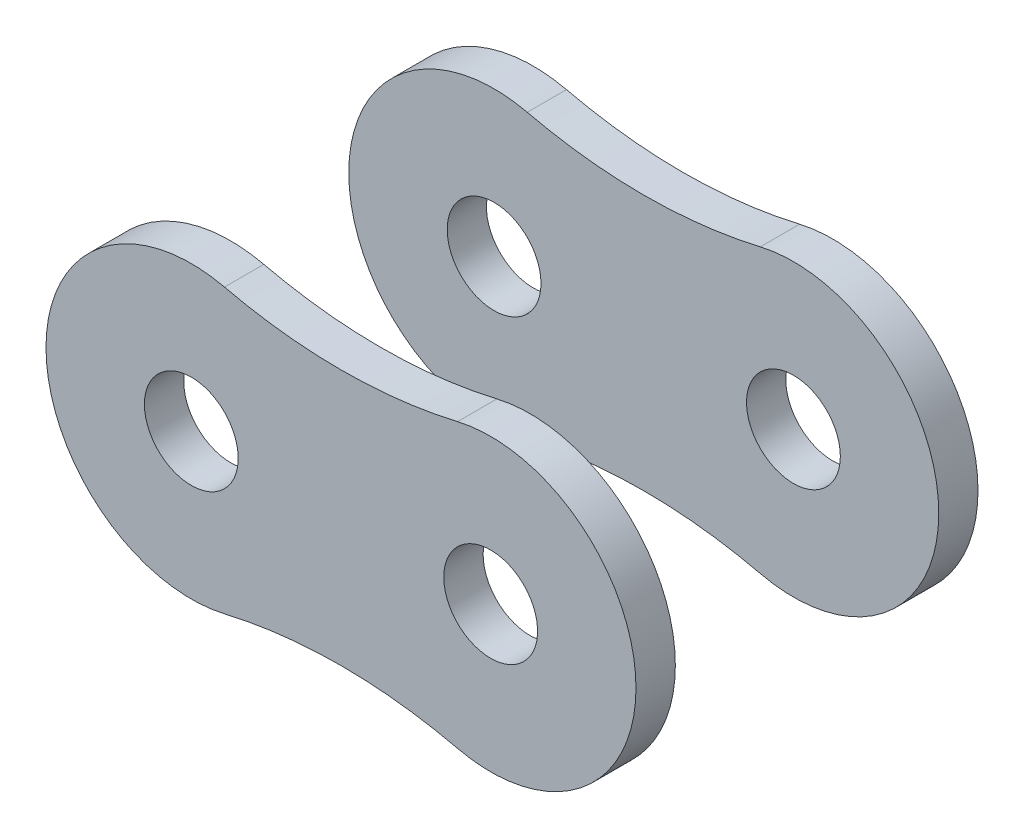
ISO-10303-21;
HEADER;
FILE_DESCRIPTION(('STEP AP214'),'2;1');
FILE_NAME('part.step','',(''),(''),'','','');
FILE_SCHEMA(('AUTOMOTIVE_DESIGN { 1 0 10303 214 1 1 1 1 }'));
ENDSEC;
DATA;
#1=APPLICATION_CONTEXT('core data for automotive mechanical design processes');
#2=APPLICATION_PROTOCOL_DEFINITION('international standard','automotive_design',2000,#1);
#3=PRODUCT_CONTEXT('',#1,'mechanical');
#4=PRODUCT('Part','Part','',(#3));
#5=PRODUCT_RELATED_PRODUCT_CATEGORY('part','',(#4));
#6=PRODUCT_DEFINITION_FORMATION('','',#4);
#7=PRODUCT_DEFINITION_CONTEXT('part definition',#1,'design');
#8=PRODUCT_DEFINITION('design','',#6,#7);
#9=PRODUCT_DEFINITION_SHAPE('','',#8);
#10=(LENGTH_UNIT() NAMED_UNIT(*) SI_UNIT(.MILLI.,.METRE.));
#11=(NAMED_UNIT(*) PLANE_ANGLE_UNIT() SI_UNIT($,.RADIAN.));
#12=(NAMED_UNIT(*) SI_UNIT($,.STERADIAN.) SOLID_ANGLE_UNIT());
#13=UNCERTAINTY_MEASURE_WITH_UNIT(LENGTH_MEASURE(1.E-05),#10,'distance_accuracy_value','');
#14=(GEOMETRIC_REPRESENTATION_CONTEXT(3) GLOBAL_UNCERTAINTY_ASSIGNED_CONTEXT((#13)) GLOBAL_UNIT_ASSIGNED_CONTEXT((#10,
#11,#12)) REPRESENTATION_CONTEXT('',''));
#15=CARTESIAN_POINT('',(0.,0.,0.));
#16=DIRECTION('',(0.,0.,1.));
#17=DIRECTION('',(1.,0.,0.));
#18=AXIS2_PLACEMENT_3D('',#15,#16,#17);
#19=CARTESIAN_POINT('',(3.175,-13.5598083674165,12.84));
#20=DIRECTION('',(0.,0.,-1.));
#21=DIRECTION('',(-1.,0.,0.));
#22=AXIS2_PLACEMENT_3D('',#19,#20,#21);
#23=PLANE('',#22);
#24=CARTESIAN_POINT('',(-6.35,0.,12.84));
#25=DIRECTION('',(0.,0.,-1.));
#26=DIRECTION('',(-1.,0.,0.));
#27=AXIS2_PLACEMENT_3D('',#24,#25,#26);
#28=CIRCLE('',#27,1.99);
#29=CARTESIAN_POINT('',(-8.34,0.,12.84));
#30=VERTEX_POINT('',#29);
#31=EDGE_CURVE('E126',#30,#30,#28,.T.);
#32=ORIENTED_EDGE('',*,*,#31,.F.);
#33=EDGE_LOOP('',(#32));
#34=FACE_BOUND('',#33,.T.);
#35=CARTESIAN_POINT('',(0.,-27.119616734833,12.84));
#36=DIRECTION('',(0.,0.,1.));
#37=DIRECTION('',(-1.,0.,0.));
#38=AXIS2_PLACEMENT_3D('',#35,#36,#37);
#39=CIRCLE('',#38,21.688116734833);
#40=CARTESIAN_POINT('',(4.94449301948166,-6.00264734327399,12.84));
#41=VERTEX_POINT('',#40);
#42=CARTESIAN_POINT('',(-4.94449301948166,-6.00264734327399,12.84));
#43=VERTEX_POINT('',#42);
#44=EDGE_CURVE('E106',#41,#43,#39,.T.);
#45=ORIENTED_EDGE('',*,*,#44,.T.);
#46=CARTESIAN_POINT('',(-6.35,0.,12.84));
#47=DIRECTION('',(0.,0.,-1.));
#48=DIRECTION('',(-1.,0.,0.));
#49=AXIS2_PLACEMENT_3D('',#46,#47,#48);
#50=CIRCLE('',#49,6.165);
#51=CARTESIAN_POINT('',(-4.94449301948167,6.00264734327399,12.84));
#52=VERTEX_POINT('',#51);
#53=EDGE_CURVE('E101',#43,#52,#50,.T.);
#54=ORIENTED_EDGE('',*,*,#53,.T.);
#55=CARTESIAN_POINT('',(0.,27.119616734833,12.84));
#56=DIRECTION('',(0.,0.,1.));
#57=DIRECTION('',(-1.,0.,0.));
#58=AXIS2_PLACEMENT_3D('',#55,#56,#57);
#59=CIRCLE('',#58,21.688116734833);
#60=CARTESIAN_POINT('',(4.94449301948166,6.00264734327399,12.84));
#61=VERTEX_POINT('',#60);
#62=EDGE_CURVE('E104',#52,#61,#59,.T.);
#63=ORIENTED_EDGE('',*,*,#62,.T.);
#64=CARTESIAN_POINT('',(6.35,0.,12.84));
#65=DIRECTION('',(0.,0.,-1.));
#66=DIRECTION('',(-1.,0.,0.));
#67=AXIS2_PLACEMENT_3D('',#64,#65,#66);
#68=CIRCLE('',#67,6.165);
#69=EDGE_CURVE('E71',#61,#41,#68,.T.);
#70=ORIENTED_EDGE('',*,*,#69,.T.);
#71=EDGE_LOOP('',(#45,#54,#63,#70));
#72=FACE_BOUND('',#71,.T.);
#73=CARTESIAN_POINT('',(6.35,0.,12.84));
#74=DIRECTION('',(0.,0.,-1.));
#75=DIRECTION('',(-1.,0.,0.));
#76=AXIS2_PLACEMENT_3D('',#73,#74,#75);
#77=CIRCLE('',#76,1.99);
#78=CARTESIAN_POINT('',(4.36,0.,12.84));
#79=VERTEX_POINT('',#78);
#80=EDGE_CURVE('E148',#79,#79,#77,.T.);
#81=ORIENTED_EDGE('',*,*,#80,.F.);
#82=EDGE_LOOP('',(#81));
#83=FACE_BOUND('',#82,.T.);
#84=ADVANCED_FACE('F53',(#34,#72,#83),#23,.T.);
#85=CARTESIAN_POINT('',(3.175,-13.5598083674165,14.51));
#86=DIRECTION('',(0.,0.,-1.));
#87=DIRECTION('',(-1.,0.,0.));
#88=AXIS2_PLACEMENT_3D('',#85,#86,#87);
#89=PLANE('',#88);
#90=CARTESIAN_POINT('',(0.,-27.119616734833,14.51));
#91=DIRECTION('',(0.,0.,1.));
#92=DIRECTION('',(-1.,0.,0.));
#93=AXIS2_PLACEMENT_3D('',#90,#91,#92);
#94=CIRCLE('',#93,21.688116734833);
#95=CARTESIAN_POINT('',(4.94449301948166,-6.00264734327399,14.51));
#96=VERTEX_POINT('',#95);
#97=CARTESIAN_POINT('',(-4.94449301948166,-6.00264734327399,14.51));
#98=VERTEX_POINT('',#97);
#99=EDGE_CURVE('E122',#96,#98,#94,.T.);
#100=ORIENTED_EDGE('',*,*,#99,.F.);
#101=CARTESIAN_POINT('',(6.35,0.,14.51));
#102=DIRECTION('',(0.,0.,-1.));
#103=DIRECTION('',(-1.,0.,0.));
#104=AXIS2_PLACEMENT_3D('',#101,#102,#103);
#105=CIRCLE('',#104,6.165);
#106=CARTESIAN_POINT('',(4.94449301948166,6.00264734327399,14.51));
#107=VERTEX_POINT('',#106);
#108=EDGE_CURVE('E94',#107,#96,#105,.T.);
#109=ORIENTED_EDGE('',*,*,#108,.F.);
#110=CARTESIAN_POINT('',(0.,27.119616734833,14.51));
#111=DIRECTION('',(0.,0.,1.));
#112=DIRECTION('',(-1.,0.,0.));
#113=AXIS2_PLACEMENT_3D('',#110,#111,#112);
#114=CIRCLE('',#113,21.688116734833);
#115=CARTESIAN_POINT('',(-4.94449301948167,6.00264734327399,14.51));
#116=VERTEX_POINT('',#115);
#117=EDGE_CURVE('E88',#116,#107,#114,.T.);
#118=ORIENTED_EDGE('',*,*,#117,.F.);
#119=CARTESIAN_POINT('',(-6.35,0.,14.51));
#120=DIRECTION('',(0.,0.,-1.));
#121=DIRECTION('',(-1.,0.,0.));
#122=AXIS2_PLACEMENT_3D('',#119,#120,#121);
#123=CIRCLE('',#122,6.165);
#124=EDGE_CURVE('E111',#98,#116,#123,.T.);
#125=ORIENTED_EDGE('',*,*,#124,.F.);
#126=EDGE_LOOP('',(#100,#109,#118,#125));
#127=FACE_BOUND('',#126,.T.);
#128=CARTESIAN_POINT('',(-6.35,0.,14.51));
#129=DIRECTION('',(0.,0.,-1.));
#130=DIRECTION('',(-1.,0.,0.));
#131=AXIS2_PLACEMENT_3D('',#128,#129,#130);
#132=CIRCLE('',#131,1.99);
#133=CARTESIAN_POINT('',(-8.34,0.,14.51));
#134=VERTEX_POINT('',#133);
#135=EDGE_CURVE('E144',#134,#134,#132,.T.);
#136=ORIENTED_EDGE('',*,*,#135,.T.);
#137=EDGE_LOOP('',(#136));
#138=FACE_BOUND('',#137,.T.);
#139=CARTESIAN_POINT('',(6.35,0.,14.51));
#140=DIRECTION('',(0.,0.,-1.));
#141=DIRECTION('',(-1.,0.,0.));
#142=AXIS2_PLACEMENT_3D('',#139,#140,#141);
#143=CIRCLE('',#142,1.99);
#144=CARTESIAN_POINT('',(4.36,0.,14.51));
#145=VERTEX_POINT('',#144);
#146=EDGE_CURVE('E152',#145,#145,#143,.T.);
#147=ORIENTED_EDGE('',*,*,#146,.T.);
#148=EDGE_LOOP('',(#147));
#149=FACE_BOUND('',#148,.T.);
#150=ADVANCED_FACE('F139',(#127,#138,#149),#89,.F.);
#151=CARTESIAN_POINT('',(0.,-27.119616734833,12.84));
#152=DIRECTION('',(0.,0.,1.));
#153=DIRECTION('',(1.,0.,0.));
#154=AXIS2_PLACEMENT_3D('',#151,#152,#153);
#155=CYLINDRICAL_SURFACE('',#154,21.688116734833);
#156=ORIENTED_EDGE('',*,*,#99,.T.);
#157=DIRECTION('',(0.,0.,1.));
#158=VECTOR('',#157,1.);
#159=CARTESIAN_POINT('',(-4.94449301948166,-6.00264734327399,12.84));
#160=LINE('',#159,#158);
#161=EDGE_CURVE('E12',#43,#98,#160,.T.);
#162=ORIENTED_EDGE('',*,*,#161,.F.);
#163=ORIENTED_EDGE('',*,*,#44,.F.);
#164=DIRECTION('',(0.,0.,1.));
#165=VECTOR('',#164,1.);
#166=CARTESIAN_POINT('',(4.94449301948166,-6.00264734327399,12.84));
#167=LINE('',#166,#165);
#168=EDGE_CURVE('E118',#41,#96,#167,.T.);
#169=ORIENTED_EDGE('',*,*,#168,.T.);
#170=EDGE_LOOP('',(#156,#162,#163,#169));
#171=FACE_BOUND('',#170,.T.);
#172=ADVANCED_FACE('F55',(#171),#155,.F.);
#173=CARTESIAN_POINT('',(-6.35,0.,12.84));
#174=DIRECTION('',(0.,0.,1.));
#175=DIRECTION('',(1.,0.,0.));
#176=AXIS2_PLACEMENT_3D('',#173,#174,#175);
#177=CYLINDRICAL_SURFACE('',#176,6.165);
#178=ORIENTED_EDGE('',*,*,#124,.T.);
#179=DIRECTION('',(0.,0.,1.));
#180=VECTOR('',#179,1.);
#181=CARTESIAN_POINT('',(-4.94449301948167,6.00264734327399,12.84));
#182=LINE('',#181,#180);
#183=EDGE_CURVE('E63',#52,#116,#182,.T.);
#184=ORIENTED_EDGE('',*,*,#183,.F.);
#185=ORIENTED_EDGE('',*,*,#53,.F.);
#186=ORIENTED_EDGE('',*,*,#161,.T.);
#187=EDGE_LOOP('',(#178,#184,#185,#186));
#188=FACE_BOUND('',#187,.T.);
#189=ADVANCED_FACE('F110',(#188),#177,.T.);
#190=CARTESIAN_POINT('',(0.,27.119616734833,12.84));
#191=DIRECTION('',(0.,0.,1.));
#192=DIRECTION('',(1.,0.,0.));
#193=AXIS2_PLACEMENT_3D('',#190,#191,#192);
#194=CYLINDRICAL_SURFACE('',#193,21.688116734833);
#195=ORIENTED_EDGE('',*,*,#117,.T.);
#196=DIRECTION('',(0.,0.,1.));
#197=VECTOR('',#196,1.);
#198=CARTESIAN_POINT('',(4.94449301948166,6.00264734327399,12.84));
#199=LINE('',#198,#197);
#200=EDGE_CURVE('E113',#61,#107,#199,.T.);
#201=ORIENTED_EDGE('',*,*,#200,.F.);
#202=ORIENTED_EDGE('',*,*,#62,.F.);
#203=ORIENTED_EDGE('',*,*,#183,.T.);
#204=EDGE_LOOP('',(#195,#201,#202,#203));
#205=FACE_BOUND('',#204,.T.);
#206=ADVANCED_FACE('F114',(#205),#194,.F.);
#207=CARTESIAN_POINT('',(6.35,0.,12.84));
#208=DIRECTION('',(0.,0.,1.));
#209=DIRECTION('',(1.,0.,0.));
#210=AXIS2_PLACEMENT_3D('',#207,#208,#209);
#211=CYLINDRICAL_SURFACE('',#210,6.165);
#212=ORIENTED_EDGE('',*,*,#108,.T.);
#213=ORIENTED_EDGE('',*,*,#168,.F.);
#214=ORIENTED_EDGE('',*,*,#69,.F.);
#215=ORIENTED_EDGE('',*,*,#200,.T.);
#216=EDGE_LOOP('',(#212,#213,#214,#215));
#217=FACE_BOUND('',#216,.T.);
#218=ADVANCED_FACE('F136',(#217),#211,.T.);
#219=CARTESIAN_POINT('',(-6.35,0.,12.84));
#220=DIRECTION('',(0.,0.,1.));
#221=DIRECTION('',(1.,0.,0.));
#222=AXIS2_PLACEMENT_3D('',#219,#220,#221);
#223=CYLINDRICAL_SURFACE('',#222,1.99);
#224=ORIENTED_EDGE('',*,*,#31,.T.);
#225=EDGE_LOOP('',(#224));
#226=FACE_BOUND('',#225,.T.);
#227=ORIENTED_EDGE('',*,*,#135,.F.);
#228=EDGE_LOOP('',(#227));
#229=FACE_BOUND('',#228,.T.);
#230=ADVANCED_FACE('F171',(#226,#229),#223,.F.);
#231=CARTESIAN_POINT('',(6.35,0.,12.84));
#232=DIRECTION('',(0.,0.,1.));
#233=DIRECTION('',(1.,0.,0.));
#234=AXIS2_PLACEMENT_3D('',#231,#232,#233);
#235=CYLINDRICAL_SURFACE('',#234,1.99);
#236=ORIENTED_EDGE('',*,*,#80,.T.);
#237=EDGE_LOOP('',(#236));
#238=FACE_BOUND('',#237,.T.);
#239=ORIENTED_EDGE('',*,*,#146,.F.);
#240=EDGE_LOOP('',(#239));
#241=FACE_BOUND('',#240,.T.);
#242=ADVANCED_FACE('F160',(#238,#241),#235,.F.);
#243=CLOSED_SHELL('',(#84,#150,#172,#189,#206,#218,#230,#242));
#244=MANIFOLD_SOLID_BREP('B2',#243);
#245=CARTESIAN_POINT('',(0.,-27.119616734833,1.665));
#246=DIRECTION('',(0.,0.,-1.));
#247=DIRECTION('',(-1.,0.,0.));
#248=AXIS2_PLACEMENT_3D('',#245,#246,#247);
#249=CYLINDRICAL_SURFACE('',#248,21.688116734833);
#250=CARTESIAN_POINT('',(0.,-27.119616734833,0.));
#251=DIRECTION('',(0.,0.,-1.));
#252=DIRECTION('',(1.,0.,0.));
#253=AXIS2_PLACEMENT_3D('',#250,#251,#252);
#254=CIRCLE('',#253,21.688116734833);
#255=CARTESIAN_POINT('',(-4.94449301948166,-6.00264734327399,0.));
#256=VERTEX_POINT('',#255);
#257=CARTESIAN_POINT('',(4.94449301948166,-6.00264734327399,0.));
#258=VERTEX_POINT('',#257);
#259=EDGE_CURVE('E313',#256,#258,#254,.T.);
#260=ORIENTED_EDGE('',*,*,#259,.T.);
#261=DIRECTION('',(0.,0.,-1.));
#262=VECTOR('',#261,1.);
#263=CARTESIAN_POINT('',(4.94449301948166,-6.00264734327399,1.665));
#264=LINE('',#263,#262);
#265=CARTESIAN_POINT('',(4.94449301948166,-6.00264734327399,1.665));
#266=VERTEX_POINT('',#265);
#267=EDGE_CURVE('E51',#266,#258,#264,.T.);
#268=ORIENTED_EDGE('',*,*,#267,.F.);
#269=CARTESIAN_POINT('',(0.,-27.119616734833,1.665));
#270=DIRECTION('',(0.,0.,-1.));
#271=DIRECTION('',(1.,0.,0.));
#272=AXIS2_PLACEMENT_3D('',#269,#270,#271);
#273=CIRCLE('',#272,21.688116734833);
#274=CARTESIAN_POINT('',(-4.94449301948166,-6.00264734327399,1.665));
#275=VERTEX_POINT('',#274);
#276=EDGE_CURVE('E301',#275,#266,#273,.T.);
#277=ORIENTED_EDGE('',*,*,#276,.F.);
#278=DIRECTION('',(0.,0.,-1.));
#279=VECTOR('',#278,1.);
#280=CARTESIAN_POINT('',(-4.94449301948166,-6.00264734327399,1.665));
#281=LINE('',#280,#279);
#282=EDGE_CURVE('E309',#275,#256,#281,.T.);
#283=ORIENTED_EDGE('',*,*,#282,.T.);
#284=EDGE_LOOP('',(#260,#268,#277,#283));
#285=FACE_BOUND('',#284,.T.);
#286=ADVANCED_FACE('F250',(#285),#249,.F.);
#287=CARTESIAN_POINT('',(6.35,0.,1.665));
#288=DIRECTION('',(0.,0.,-1.));
#289=DIRECTION('',(-1.,0.,0.));
#290=AXIS2_PLACEMENT_3D('',#287,#288,#289);
#291=CYLINDRICAL_SURFACE('',#290,6.165);
#292=CARTESIAN_POINT('',(6.35,0.,0.));
#293=DIRECTION('',(0.,0.,1.));
#294=DIRECTION('',(1.,0.,0.));
#295=AXIS2_PLACEMENT_3D('',#292,#293,#294);
#296=CIRCLE('',#295,6.165);
#297=CARTESIAN_POINT('',(4.94449301948165,6.00264734327398,0.));
#298=VERTEX_POINT('',#297);
#299=EDGE_CURVE('E305',#258,#298,#296,.T.);
#300=ORIENTED_EDGE('',*,*,#299,.T.);
#301=DIRECTION('',(0.,0.,-1.));
#302=VECTOR('',#301,1.);
#303=CARTESIAN_POINT('',(4.94449301948165,6.00264734327398,1.665));
#304=LINE('',#303,#302);
#305=CARTESIAN_POINT('',(4.94449301948165,6.00264734327398,1.665));
#306=VERTEX_POINT('',#305);
#307=EDGE_CURVE('E258',#306,#298,#304,.T.);
#308=ORIENTED_EDGE('',*,*,#307,.F.);
#309=CARTESIAN_POINT('',(6.35,0.,1.665));
#310=DIRECTION('',(0.,0.,1.));
#311=DIRECTION('',(1.,0.,0.));
#312=AXIS2_PLACEMENT_3D('',#309,#310,#311);
#313=CIRCLE('',#312,6.165);
#314=EDGE_CURVE('E296',#266,#306,#313,.T.);
#315=ORIENTED_EDGE('',*,*,#314,.F.);
#316=ORIENTED_EDGE('',*,*,#267,.T.);
#317=EDGE_LOOP('',(#300,#308,#315,#316));
#318=FACE_BOUND('',#317,.T.);
#319=ADVANCED_FACE('F304',(#318),#291,.T.);
#320=CARTESIAN_POINT('',(0.,27.119616734833,1.665));
#321=DIRECTION('',(0.,0.,-1.));
#322=DIRECTION('',(-1.,0.,0.));
#323=AXIS2_PLACEMENT_3D('',#320,#321,#322);
#324=CYLINDRICAL_SURFACE('',#323,21.688116734833);
#325=CARTESIAN_POINT('',(0.,27.119616734833,0.));
#326=DIRECTION('',(0.,0.,-1.));
#327=DIRECTION('',(1.,0.,0.));
#328=AXIS2_PLACEMENT_3D('',#325,#326,#327);
#329=CIRCLE('',#328,21.688116734833);
#330=CARTESIAN_POINT('',(-4.94449301948166,6.00264734327399,0.));
#331=VERTEX_POINT('',#330);
#332=EDGE_CURVE('E283',#298,#331,#329,.T.);
#333=ORIENTED_EDGE('',*,*,#332,.T.);
#334=DIRECTION('',(0.,0.,-1.));
#335=VECTOR('',#334,1.);
#336=CARTESIAN_POINT('',(-4.94449301948166,6.00264734327399,1.665));
#337=LINE('',#336,#335);
#338=CARTESIAN_POINT('',(-4.94449301948166,6.00264734327399,1.665));
#339=VERTEX_POINT('',#338);
#340=EDGE_CURVE('E306',#339,#331,#337,.T.);
#341=ORIENTED_EDGE('',*,*,#340,.F.);
#342=CARTESIAN_POINT('',(0.,27.119616734833,1.665));
#343=DIRECTION('',(0.,0.,-1.));
#344=DIRECTION('',(1.,0.,0.));
#345=AXIS2_PLACEMENT_3D('',#342,#343,#344);
#346=CIRCLE('',#345,21.688116734833);
#347=EDGE_CURVE('E299',#306,#339,#346,.T.);
#348=ORIENTED_EDGE('',*,*,#347,.F.);
#349=ORIENTED_EDGE('',*,*,#307,.T.);
#350=EDGE_LOOP('',(#333,#341,#348,#349));
#351=FACE_BOUND('',#350,.T.);
#352=ADVANCED_FACE('F307',(#351),#324,.F.);
#353=CARTESIAN_POINT('',(-6.35,0.,1.665));
#354=DIRECTION('',(0.,0.,-1.));
#355=DIRECTION('',(-1.,0.,0.));
#356=AXIS2_PLACEMENT_3D('',#353,#354,#355);
#357=CYLINDRICAL_SURFACE('',#356,6.165);
#358=CARTESIAN_POINT('',(-6.35,0.,0.));
#359=DIRECTION('',(0.,0.,1.));
#360=DIRECTION('',(1.,0.,0.));
#361=AXIS2_PLACEMENT_3D('',#358,#359,#360);
#362=CIRCLE('',#361,6.165);
#363=EDGE_CURVE('E289',#331,#256,#362,.T.);
#364=ORIENTED_EDGE('',*,*,#363,.T.);
#365=ORIENTED_EDGE('',*,*,#282,.F.);
#366=CARTESIAN_POINT('',(-6.35,0.,1.665));
#367=DIRECTION('',(0.,0.,1.));
#368=DIRECTION('',(1.,0.,0.));
#369=AXIS2_PLACEMENT_3D('',#366,#367,#368);
#370=CIRCLE('',#369,6.165);
#371=EDGE_CURVE('E266',#339,#275,#370,.T.);
#372=ORIENTED_EDGE('',*,*,#371,.F.);
#373=ORIENTED_EDGE('',*,*,#340,.T.);
#374=EDGE_LOOP('',(#364,#365,#372,#373));
#375=FACE_BOUND('',#374,.T.);
#376=ADVANCED_FACE('F321',(#375),#357,.T.);
#377=CARTESIAN_POINT('',(-3.175,-13.5598083674165,1.665));
#378=DIRECTION('',(0.,0.,1.));
#379=DIRECTION('',(1.,0.,0.));
#380=AXIS2_PLACEMENT_3D('',#377,#378,#379);
#381=PLANE('',#380);
#382=CARTESIAN_POINT('',(6.35,0.,1.665));
#383=DIRECTION('',(0.,0.,1.));
#384=DIRECTION('',(1.,0.,0.));
#385=AXIS2_PLACEMENT_3D('',#382,#383,#384);
#386=CIRCLE('',#385,1.99);
#387=CARTESIAN_POINT('',(8.34,0.,1.665));
#388=VERTEX_POINT('',#387);
#389=EDGE_CURVE('E333',#388,#388,#386,.T.);
#390=ORIENTED_EDGE('',*,*,#389,.F.);
#391=EDGE_LOOP('',(#390));
#392=FACE_BOUND('',#391,.T.);
#393=CARTESIAN_POINT('',(-6.35,0.,1.665));
#394=DIRECTION('',(0.,0.,1.));
#395=DIRECTION('',(1.,0.,0.));
#396=AXIS2_PLACEMENT_3D('',#393,#394,#395);
#397=CIRCLE('',#396,1.99);
#398=CARTESIAN_POINT('',(-4.36,0.,1.665));
#399=VERTEX_POINT('',#398);
#400=EDGE_CURVE('E327',#399,#399,#397,.T.);
#401=ORIENTED_EDGE('',*,*,#400,.F.);
#402=EDGE_LOOP('',(#401));
#403=FACE_BOUND('',#402,.T.);
#404=ORIENTED_EDGE('',*,*,#276,.T.);
#405=ORIENTED_EDGE('',*,*,#314,.T.);
#406=ORIENTED_EDGE('',*,*,#347,.T.);
#407=ORIENTED_EDGE('',*,*,#371,.T.);
#408=EDGE_LOOP('',(#404,#405,#406,#407));
#409=FACE_BOUND('',#408,.T.);
#410=ADVANCED_FACE('F297',(#392,#403,#409),#381,.T.);
#411=CARTESIAN_POINT('',(-3.175,-13.5598083674165,0.));
#412=DIRECTION('',(0.,0.,1.));
#413=DIRECTION('',(1.,0.,0.));
#414=AXIS2_PLACEMENT_3D('',#411,#412,#413);
#415=PLANE('',#414);
#416=CARTESIAN_POINT('',(6.35,0.,0.));
#417=DIRECTION('',(0.,0.,1.));
#418=DIRECTION('',(1.,0.,0.));
#419=AXIS2_PLACEMENT_3D('',#416,#417,#418);
#420=CIRCLE('',#419,1.99);
#421=CARTESIAN_POINT('',(8.34,0.,0.));
#422=VERTEX_POINT('',#421);
#423=EDGE_CURVE('E330',#422,#422,#420,.T.);
#424=ORIENTED_EDGE('',*,*,#423,.T.);
#425=EDGE_LOOP('',(#424));
#426=FACE_BOUND('',#425,.T.);
#427=CARTESIAN_POINT('',(-6.35,0.,0.));
#428=DIRECTION('',(0.,0.,1.));
#429=DIRECTION('',(1.,0.,0.));
#430=AXIS2_PLACEMENT_3D('',#427,#428,#429);
#431=CIRCLE('',#430,1.99);
#432=CARTESIAN_POINT('',(-4.36,0.,0.));
#433=VERTEX_POINT('',#432);
#434=EDGE_CURVE('E316',#433,#433,#431,.T.);
#435=ORIENTED_EDGE('',*,*,#434,.T.);
#436=EDGE_LOOP('',(#435));
#437=FACE_BOUND('',#436,.T.);
#438=ORIENTED_EDGE('',*,*,#259,.F.);
#439=ORIENTED_EDGE('',*,*,#363,.F.);
#440=ORIENTED_EDGE('',*,*,#332,.F.);
#441=ORIENTED_EDGE('',*,*,#299,.F.);
#442=EDGE_LOOP('',(#438,#439,#440,#441));
#443=FACE_BOUND('',#442,.T.);
#444=ADVANCED_FACE('F324',(#426,#437,#443),#415,.F.);
#445=CARTESIAN_POINT('',(-6.35,0.,0.));
#446=DIRECTION('',(0.,0.,1.));
#447=DIRECTION('',(1.,0.,0.));
#448=AXIS2_PLACEMENT_3D('',#445,#446,#447);
#449=CYLINDRICAL_SURFACE('',#448,1.99);
#450=ORIENTED_EDGE('',*,*,#434,.F.);
#451=EDGE_LOOP('',(#450));
#452=FACE_BOUND('',#451,.T.);
#453=ORIENTED_EDGE('',*,*,#400,.T.);
#454=EDGE_LOOP('',(#453));
#455=FACE_BOUND('',#454,.T.);
#456=ADVANCED_FACE('F344',(#452,#455),#449,.F.);
#457=CARTESIAN_POINT('',(6.35,0.,0.));
#458=DIRECTION('',(0.,0.,1.));
#459=DIRECTION('',(1.,0.,0.));
#460=AXIS2_PLACEMENT_3D('',#457,#458,#459);
#461=CYLINDRICAL_SURFACE('',#460,1.99);
#462=ORIENTED_EDGE('',*,*,#423,.F.);
#463=EDGE_LOOP('',(#462));
#464=FACE_BOUND('',#463,.T.);
#465=ORIENTED_EDGE('',*,*,#389,.T.);
#466=EDGE_LOOP('',(#465));
#467=FACE_BOUND('',#466,.T.);
#468=ADVANCED_FACE('F341',(#464,#467),#461,.F.);
#469=CLOSED_SHELL('',(#286,#319,#352,#376,#410,#444,#456,#468));
#470=MANIFOLD_SOLID_BREP('B6',#469);
#471=ADVANCED_BREP_SHAPE_REPRESENTATION('',(#18,#244,#470),#14);
#472=SHAPE_DEFINITION_REPRESENTATION(#9,#471);
ENDSEC;
END-ISO-10303-21;
